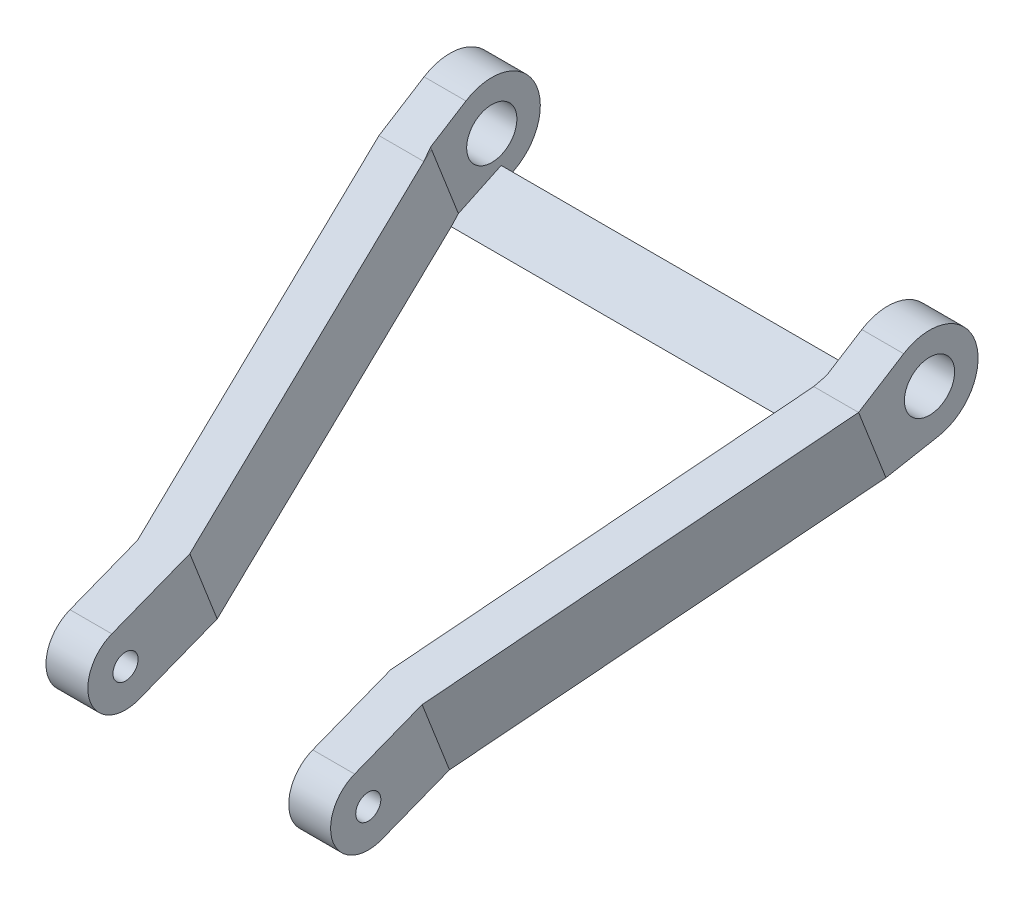
ISO-10303-21;
HEADER;
FILE_DESCRIPTION(('STEP AP214'),'2;1');
FILE_NAME('part.step','',(''),(''),'','','');
FILE_SCHEMA(('AUTOMOTIVE_DESIGN { 1 0 10303 214 1 1 1 1 }'));
ENDSEC;
DATA;
#1=APPLICATION_CONTEXT('core data for automotive mechanical design processes');
#2=APPLICATION_PROTOCOL_DEFINITION('international standard','automotive_design',2000,#1);
#3=PRODUCT_CONTEXT('',#1,'mechanical');
#4=PRODUCT('Part','Part','',(#3));
#5=PRODUCT_RELATED_PRODUCT_CATEGORY('part','',(#4));
#6=PRODUCT_DEFINITION_FORMATION('','',#4);
#7=PRODUCT_DEFINITION_CONTEXT('part definition',#1,'design');
#8=PRODUCT_DEFINITION('design','',#6,#7);
#9=PRODUCT_DEFINITION_SHAPE('','',#8);
#10=(LENGTH_UNIT() NAMED_UNIT(*) SI_UNIT(.MILLI.,.METRE.));
#11=(NAMED_UNIT(*) PLANE_ANGLE_UNIT() SI_UNIT($,.RADIAN.));
#12=(NAMED_UNIT(*) SI_UNIT($,.STERADIAN.) SOLID_ANGLE_UNIT());
#13=UNCERTAINTY_MEASURE_WITH_UNIT(LENGTH_MEASURE(1.E-05),#10,'distance_accuracy_value','');
#14=(GEOMETRIC_REPRESENTATION_CONTEXT(3) GLOBAL_UNCERTAINTY_ASSIGNED_CONTEXT((#13)) GLOBAL_UNIT_ASSIGNED_CONTEXT((#10,
#11,#12)) REPRESENTATION_CONTEXT('',''));
#15=CARTESIAN_POINT('',(0.,0.,0.));
#16=DIRECTION('',(0.,0.,1.));
#17=DIRECTION('',(1.,0.,0.));
#18=AXIS2_PLACEMENT_3D('',#15,#16,#17);
#19=CARTESIAN_POINT('',(34.120658976696,60.3909629733149,82.3929738047805));
#20=DIRECTION('',(1.,0.,0.));
#21=DIRECTION('',(0.,-0.931603821902385,-0.363475334812239));
#22=AXIS2_PLACEMENT_3D('',#19,#20,#21);
#23=PLANE('',#22);
#24=CARTESIAN_POINT('',(34.1206589766954,72.9910744899168,23.4764782511687));
#25=DIRECTION('',(1.,0.,0.));
#26=DIRECTION('',(0.,1.,0.));
#27=AXIS2_PLACEMENT_3D('',#24,#25,#26);
#28=CIRCLE('',#27,3.);
#29=CARTESIAN_POINT('',(34.1206589766954,75.9910744899168,23.4764782511687));
#30=VERTEX_POINT('',#29);
#31=EDGE_CURVE('E285',#30,#30,#28,.T.);
#32=ORIENTED_EDGE('',*,*,#31,.T.);
#33=EDGE_LOOP('',(#32));
#34=FACE_BOUND('',#33,.T.);
#35=CARTESIAN_POINT('',(34.1206589766951,72.9910744899168,23.4764782511687));
#36=DIRECTION('',(1.,0.,0.));
#37=DIRECTION('',(0.,1.,0.));
#38=AXIS2_PLACEMENT_3D('',#35,#36,#37);
#39=CIRCLE('',#38,5.80029163560258);
#40=CARTESIAN_POINT('',(34.1206589766951,67.2873889922915,22.4222701112737));
#41=VERTEX_POINT('',#40);
#42=CARTESIAN_POINT('',(34.120658976695,77.9016243386705,26.5635291482136));
#43=VERTEX_POINT('',#42);
#44=EDGE_CURVE('E481',#41,#43,#39,.T.);
#45=ORIENTED_EDGE('',*,*,#44,.F.);
#46=DIRECTION('',(0.,0.181750885321719,-0.983344606780742));
#47=VECTOR('',#46,1.);
#48=CARTESIAN_POINT('',(34.1206589766951,69.07205107404,12.7665381465735));
#49=LINE('',#48,#47);
#50=CARTESIAN_POINT('',(34.1206589766951,66.1310406703247,28.6785746346503));
#51=VERTEX_POINT('',#50);
#52=EDGE_CURVE('E476',#51,#41,#49,.T.);
#53=ORIENTED_EDGE('',*,*,#52,.F.);
#54=DIRECTION('',(0.,0.931603821902385,0.363475334812239));
#55=VECTOR('',#54,1.);
#56=CARTESIAN_POINT('',(34.120658976696,66.1310406703247,28.6785746346503));
#57=LINE('',#56,#55);
#58=CARTESIAN_POINT('',(34.1206589766951,74.5154750674462,31.9498526479605));
#59=VERTEX_POINT('',#58);
#60=EDGE_CURVE('E249',#51,#59,#57,.T.);
#61=ORIENTED_EDGE('',*,*,#60,.T.);
#62=DIRECTION('',(0.,0.532223393406022,-0.846603956706664));
#63=VECTOR('',#62,1.);
#64=CARTESIAN_POINT('',(34.1206589766951,67.8041341734298,42.6255347507706));
#65=LINE('',#64,#63);
#66=EDGE_CURVE('E483',#59,#43,#65,.T.);
#67=ORIENTED_EDGE('',*,*,#66,.T.);
#68=EDGE_LOOP('',(#45,#53,#61,#67));
#69=FACE_BOUND('',#68,.T.);
#70=ADVANCED_FACE('F106',(#34,#69),#23,.F.);
#71=CARTESIAN_POINT('',(39.1206589766959,78.6371930277265,21.3857019702141));
#72=DIRECTION('',(-1.,0.,0.));
#73=DIRECTION('',(0.,0.931603821902385,0.363475334812239));
#74=AXIS2_PLACEMENT_3D('',#71,#72,#73);
#75=PLANE('',#74);
#76=CARTESIAN_POINT('',(39.1206589766959,72.9910744899168,23.4764782511687));
#77=DIRECTION('',(-1.,0.,0.));
#78=DIRECTION('',(0.,-1.,0.));
#79=AXIS2_PLACEMENT_3D('',#76,#77,#78);
#80=CIRCLE('',#79,3.);
#81=CARTESIAN_POINT('',(39.1206589766959,69.9910744899168,23.4764782511687));
#82=VERTEX_POINT('',#81);
#83=EDGE_CURVE('E281',#82,#82,#80,.T.);
#84=ORIENTED_EDGE('',*,*,#83,.T.);
#85=EDGE_LOOP('',(#84));
#86=FACE_BOUND('',#85,.T.);
#87=DIRECTION('',(0.,0.903908239724991,0.427726424431866));
#88=VECTOR('',#87,1.);
#89=CARTESIAN_POINT('',(39.120658976696,66.4134009221729,21.0680376832798));
#90=LINE('',#89,#88);
#91=CARTESIAN_POINT('',(39.120658976696,67.5075795570489,21.5857994367601));
#92=VERTEX_POINT('',#91);
#93=CARTESIAN_POINT('',(39.1206589766959,69.1251256413478,22.3512169565754));
#94=VERTEX_POINT('',#93);
#95=EDGE_CURVE('E124',#92,#94,#90,.T.);
#96=ORIENTED_EDGE('',*,*,#95,.F.);
#97=CARTESIAN_POINT('',(39.1206589766959,72.9910744899168,23.4764782511687));
#98=DIRECTION('',(-1.,0.,0.));
#99=DIRECTION('',(0.,-1.,0.));
#100=AXIS2_PLACEMENT_3D('',#97,#98,#99);
#101=CIRCLE('',#100,5.80029163560258);
#102=CARTESIAN_POINT('',(39.1206589766959,77.9016243386705,26.5635291482136));
#103=VERTEX_POINT('',#102);
#104=EDGE_CURVE('E302',#103,#92,#101,.T.);
#105=ORIENTED_EDGE('',*,*,#104,.F.);
#106=DIRECTION('',(0.,-0.532223393406022,0.846603956706664));
#107=VECTOR('',#106,1.);
#108=CARTESIAN_POINT('',(39.1206589766958,80.4430207614376,22.520947980735));
#109=LINE('',#108,#107);
#110=CARTESIAN_POINT('',(39.1206589766959,75.2549732080281,30.7735382289582));
#111=VERTEX_POINT('',#110);
#112=EDGE_CURVE('E295',#103,#111,#109,.T.);
#113=ORIENTED_EDGE('',*,*,#112,.T.);
#114=DIRECTION('',(0.,-0.954738972529964,-0.297444943363354));
#115=VECTOR('',#114,1.);
#116=CARTESIAN_POINT('',(39.1206589766959,77.7791704198332,31.5599413384006));
#117=LINE('',#116,#115);
#118=CARTESIAN_POINT('',(39.1206589766959,74.9149535022433,30.6676065083105));
#119=VERTEX_POINT('',#118);
#120=EDGE_CURVE('E290',#111,#119,#117,.T.);
#121=ORIENTED_EDGE('',*,*,#120,.T.);
#122=DIRECTION('',(0.,-0.931603821902385,-0.363475334812239));
#123=VECTOR('',#122,1.);
#124=CARTESIAN_POINT('',(39.1206589766959,75.0024396796041,30.701740189238));
#125=LINE('',#124,#123);
#126=CARTESIAN_POINT('',(39.120658976696,66.7054914598434,27.4645958568553));
#127=VERTEX_POINT('',#126);
#128=EDGE_CURVE('E410',#119,#127,#125,.T.);
#129=ORIENTED_EDGE('',*,*,#128,.T.);
#130=DIRECTION('',(0.,-0.427726424431866,0.903908239724991));
#131=VECTOR('',#130,1.);
#132=CARTESIAN_POINT('',(39.1206589766959,71.2386500187441,17.8847356019905));
#133=LINE('',#132,#131);
#134=EDGE_CURVE('E278',#94,#127,#133,.T.);
#135=ORIENTED_EDGE('',*,*,#134,.F.);
#136=EDGE_LOOP('',(#96,#105,#113,#121,#129,#135));
#137=FACE_BOUND('',#136,.T.);
#138=ADVANCED_FACE('F300',(#86,#137),#75,.F.);
#139=CARTESIAN_POINT('',(91.4143730359225,66.986493519189,26.8707581552003));
#140=DIRECTION('',(-1.,0.,0.));
#141=DIRECTION('',(0.,-0.427726424431866,0.903908239724991));
#142=AXIS2_PLACEMENT_3D('',#139,#140,#141);
#143=PLANE('',#142);
#144=CARTESIAN_POINT('',(91.4143730359225,72.9910744899173,23.4764782511686));
#145=DIRECTION('',(-1.,0.,0.));
#146=DIRECTION('',(0.,-1.,0.));
#147=AXIS2_PLACEMENT_3D('',#144,#145,#146);
#148=CIRCLE('',#147,3.);
#149=CARTESIAN_POINT('',(91.4143730359225,69.9910744899173,23.4764782511686));
#150=VERTEX_POINT('',#149);
#151=EDGE_CURVE('E326',#150,#150,#148,.T.);
#152=ORIENTED_EDGE('',*,*,#151,.T.);
#153=EDGE_LOOP('',(#152));
#154=FACE_BOUND('',#153,.T.);
#155=DIRECTION('',(0.,-0.181750885321719,0.983344606780742));
#156=VECTOR('',#155,1.);
#157=CARTESIAN_POINT('',(91.4143730359225,66.4823989187325,26.7775867081948));
#158=LINE('',#157,#156);
#159=CARTESIAN_POINT('',(91.4143730359225,67.2873889922921,22.4222701112737));
#160=VERTEX_POINT('',#159);
#161=CARTESIAN_POINT('',(91.4143696906281,66.1310406703253,28.6785746346503));
#162=VERTEX_POINT('',#161);
#163=EDGE_CURVE('E464',#160,#162,#158,.T.);
#164=ORIENTED_EDGE('',*,*,#163,.F.);
#165=CARTESIAN_POINT('',(91.4143730359225,72.9910744899173,23.4764782511686));
#166=DIRECTION('',(1.,0.,0.));
#167=DIRECTION('',(0.,1.,0.));
#168=AXIS2_PLACEMENT_3D('',#165,#166,#167);
#169=CIRCLE('',#168,5.80029163560258);
#170=CARTESIAN_POINT('',(91.4143730359224,77.901624338671,26.5635291482136));
#171=VERTEX_POINT('',#170);
#172=EDGE_CURVE('E110',#160,#171,#169,.T.);
#173=ORIENTED_EDGE('',*,*,#172,.T.);
#174=DIRECTION('',(0.,-0.532223393406022,0.846603956706664));
#175=VECTOR('',#174,1.);
#176=CARTESIAN_POINT('',(91.4143730359225,74.6713533923311,31.7018981081058));
#177=LINE('',#176,#175);
#178=CARTESIAN_POINT('',(91.4143730359225,74.5154750674468,31.9498526479604));
#179=VERTEX_POINT('',#178);
#180=EDGE_CURVE('E138',#171,#179,#177,.T.);
#181=ORIENTED_EDGE('',*,*,#180,.T.);
#182=DIRECTION('',(0.,-0.931603821902385,-0.363475334812239));
#183=VECTOR('',#182,1.);
#184=CARTESIAN_POINT('',(91.4143730359225,74.5154750674468,31.9498526479604));
#185=LINE('',#184,#183);
#186=EDGE_CURVE('E346',#179,#162,#185,.T.);
#187=ORIENTED_EDGE('',*,*,#186,.T.);
#188=EDGE_LOOP('',(#164,#173,#181,#187));
#189=FACE_BOUND('',#188,.T.);
#190=ADVANCED_FACE('F461',(#154,#189),#143,.F.);
#191=CARTESIAN_POINT('',(86.4143730359225,70.2527586306055,18.114423956904));
#192=DIRECTION('',(1.,0.,0.));
#193=DIRECTION('',(0.,-0.931603821902385,-0.363475334812239));
#194=AXIS2_PLACEMENT_3D('',#191,#192,#193);
#195=PLANE('',#194);
#196=CARTESIAN_POINT('',(86.4143730359225,72.9910744899173,23.4764782511686));
#197=DIRECTION('',(1.,0.,0.));
#198=DIRECTION('',(0.,1.,0.));
#199=AXIS2_PLACEMENT_3D('',#196,#197,#198);
#200=CIRCLE('',#199,3.);
#201=CARTESIAN_POINT('',(86.4143730359225,75.9910744899173,23.4764782511686));
#202=VERTEX_POINT('',#201);
#203=EDGE_CURVE('E325',#202,#202,#200,.T.);
#204=ORIENTED_EDGE('',*,*,#203,.T.);
#205=EDGE_LOOP('',(#204));
#206=FACE_BOUND('',#205,.T.);
#207=CARTESIAN_POINT('',(86.4143730359225,72.9910744899173,23.4764782511686));
#208=DIRECTION('',(1.,0.,0.));
#209=DIRECTION('',(0.,1.,0.));
#210=AXIS2_PLACEMENT_3D('',#207,#208,#209);
#211=CIRCLE('',#210,5.80029163560258);
#212=CARTESIAN_POINT('',(86.4143730359225,67.5075795570494,21.58579943676));
#213=VERTEX_POINT('',#212);
#214=CARTESIAN_POINT('',(86.4143730359224,77.901624338671,26.5635291482136));
#215=VERTEX_POINT('',#214);
#216=EDGE_CURVE('E150',#213,#215,#211,.T.);
#217=ORIENTED_EDGE('',*,*,#216,.F.);
#218=DIRECTION('',(0.,-0.903908239724991,-0.427726424431866));
#219=VECTOR('',#218,1.);
#220=CARTESIAN_POINT('',(86.4143730359225,69.1251256413483,22.3512169565754));
#221=LINE('',#220,#219);
#222=CARTESIAN_POINT('',(86.4143730359225,69.1251256413483,22.3512169565754));
#223=VERTEX_POINT('',#222);
#224=EDGE_CURVE('E321',#223,#213,#221,.T.);
#225=ORIENTED_EDGE('',*,*,#224,.F.);
#226=DIRECTION('',(0.,-0.427726424431866,0.903908239724991));
#227=VECTOR('',#226,1.);
#228=CARTESIAN_POINT('',(86.4143730359225,70.9694779324924,18.4535731878156));
#229=LINE('',#228,#227);
#230=CARTESIAN_POINT('',(86.4143730359226,66.7054914598439,27.4645958568553));
#231=VERTEX_POINT('',#230);
#232=EDGE_CURVE('E384',#223,#231,#229,.T.);
#233=ORIENTED_EDGE('',*,*,#232,.T.);
#234=DIRECTION('',(0.,0.931603821902385,0.363475334812239));
#235=VECTOR('',#234,1.);
#236=CARTESIAN_POINT('',(86.4143730359226,66.6180052824831,27.4304621759278));
#237=LINE('',#236,#235);
#238=CARTESIAN_POINT('',(86.4143730359225,74.9149535022438,30.6676065083105));
#239=VERTEX_POINT('',#238);
#240=EDGE_CURVE('E343',#231,#239,#237,.T.);
#241=ORIENTED_EDGE('',*,*,#240,.T.);
#242=DIRECTION('',(0.,-0.954738972529964,-0.297444943363354));
#243=VECTOR('',#242,1.);
#244=CARTESIAN_POINT('',(86.4143730359224,77.7791704198337,31.5599413384006));
#245=LINE('',#244,#243);
#246=CARTESIAN_POINT('',(86.4143730359225,75.2549732080285,30.7735382289582));
#247=VERTEX_POINT('',#246);
#248=EDGE_CURVE('E319',#247,#239,#245,.T.);
#249=ORIENTED_EDGE('',*,*,#248,.F.);
#250=DIRECTION('',(0.,0.532223393406022,-0.846603956706664));
#251=VECTOR('',#250,1.);
#252=CARTESIAN_POINT('',(86.4143730359224,79.5420116798602,23.9541767018756));
#253=LINE('',#252,#251);
#254=EDGE_CURVE('E307',#247,#215,#253,.T.);
#255=ORIENTED_EDGE('',*,*,#254,.T.);
#256=EDGE_LOOP('',(#217,#225,#233,#241,#249,#255));
#257=FACE_BOUND('',#256,.T.);
#258=ADVANCED_FACE('F442',(#206,#257),#195,.F.);
#259=CARTESIAN_POINT('',(86.4143730359225,69.1251256413483,22.3512169565754));
#260=DIRECTION('',(0.,-0.427726424431866,0.903908239724991));
#261=DIRECTION('',(1.,0.,0.));
#262=AXIS2_PLACEMENT_3D('',#259,#260,#261);
#263=PLANE('',#262);
#264=DIRECTION('',(1.,0.,0.));
#265=VECTOR('',#264,1.);
#266=CARTESIAN_POINT('',(34.1206589766951,67.5075795570489,21.5857994367601));
#267=LINE('',#266,#265);
#268=EDGE_CURVE('E12',#92,#213,#267,.T.);
#269=ORIENTED_EDGE('',*,*,#268,.F.);
#270=ORIENTED_EDGE('',*,*,#95,.T.);
#271=DIRECTION('',(-1.,0.,0.));
#272=VECTOR('',#271,1.);
#273=CARTESIAN_POINT('',(86.4143730359225,69.1251256413483,22.3512169565754));
#274=LINE('',#273,#272);
#275=EDGE_CURVE('E392',#223,#94,#274,.T.);
#276=ORIENTED_EDGE('',*,*,#275,.F.);
#277=ORIENTED_EDGE('',*,*,#224,.T.);
#278=EDGE_LOOP('',(#269,#270,#276,#277));
#279=FACE_BOUND('',#278,.T.);
#280=ADVANCED_FACE('F441',(#279),#263,.F.);
#281=CARTESIAN_POINT('',(45.7675160063095,47.1841923442209,77.2402090099819));
#282=DIRECTION('',(0.,-0.931603821902385,-0.363475334812239));
#283=DIRECTION('',(0.,-0.363475334812239,0.931603821902385));
#284=AXIS2_PLACEMENT_3D('',#281,#282,#283);
#285=PLANE('',#284);
#286=DIRECTION('',(0.258819045102521,-0.351090213114205,0.899860191445116));
#287=VECTOR('',#286,1.);
#288=CARTESIAN_POINT('',(34.120658976696,66.1310406703247,28.6785746346503));
#289=LINE('',#288,#287);
#290=CARTESIAN_POINT('',(45.7675160063094,50.3319810801855,69.1722832496805));
#291=VERTEX_POINT('',#290);
#292=EDGE_CURVE('E416',#51,#291,#289,.T.);
#293=ORIENTED_EDGE('',*,*,#292,.F.);
#294=DIRECTION('',(-1.,0.,0.));
#295=VECTOR('',#294,1.);
#296=CARTESIAN_POINT('',(50.7675160063093,66.1310406703249,28.6785746346503));
#297=LINE('',#296,#295);
#298=CARTESIAN_POINT('',(39.4796428253184,66.1310406703248,28.6785746346503));
#299=VERTEX_POINT('',#298);
#300=EDGE_CURVE('E402',#299,#51,#297,.T.);
#301=ORIENTED_EDGE('',*,*,#300,.F.);
#302=DIRECTION('',(0.258819045102521,-0.351090213114205,0.899860191445116));
#303=VECTOR('',#302,1.);
#304=CARTESIAN_POINT('',(39.120658976696,66.6180052824826,27.4304621759278));
#305=LINE('',#304,#303);
#306=CARTESIAN_POINT('',(50.7675160063094,50.8189456923434,67.924170790958));
#307=VERTEX_POINT('',#306);
#308=EDGE_CURVE('E419',#299,#307,#305,.T.);
#309=ORIENTED_EDGE('',*,*,#308,.T.);
#310=DIRECTION('',(0.,0.363475334812239,-0.931603821902385));
#311=VECTOR('',#310,1.);
#312=CARTESIAN_POINT('',(50.7675160063095,47.184192344221,77.2402090099819));
#313=LINE('',#312,#311);
#314=CARTESIAN_POINT('',(50.7675160063095,47.184192344221,77.2402090099819));
#315=VERTEX_POINT('',#314);
#316=EDGE_CURVE('E266',#315,#307,#313,.T.);
#317=ORIENTED_EDGE('',*,*,#316,.F.);
#318=DIRECTION('',(1.,0.,0.));
#319=VECTOR('',#318,1.);
#320=CARTESIAN_POINT('',(45.7675160063095,47.1841923442209,77.2402090099819));
#321=LINE('',#320,#319);
#322=CARTESIAN_POINT('',(45.7675160063095,47.1841923442209,77.2402090099819));
#323=VERTEX_POINT('',#322);
#324=EDGE_CURVE('E275',#323,#315,#321,.T.);
#325=ORIENTED_EDGE('',*,*,#324,.F.);
#326=DIRECTION('',(0.,0.363475334812239,-0.931603821902385));
#327=VECTOR('',#326,1.);
#328=CARTESIAN_POINT('',(45.7675160063095,47.1841923442209,77.2402090099819));
#329=LINE('',#328,#327);
#330=EDGE_CURVE('E267',#323,#291,#329,.T.);
#331=ORIENTED_EDGE('',*,*,#330,.T.);
#332=EDGE_LOOP('',(#293,#301,#309,#317,#325,#331));
#333=FACE_BOUND('',#332,.T.);
#334=ADVANCED_FACE('F108',(#333),#285,.T.);
#335=CARTESIAN_POINT('',(39.1206589766959,75.0024396796041,30.701740189238));
#336=DIRECTION('',(-0.965925826289068,-0.094074339074431,0.241116811598632));
#337=DIRECTION('',(0.258819045102522,-0.351090213114206,0.899860191445116));
#338=AXIS2_PLACEMENT_3D('',#335,#336,#337);
#339=PLANE('',#338);
#340=DIRECTION('',(0.258227844034216,-0.413219673950163,0.873251327869567));
#341=VECTOR('',#340,1.);
#342=CARTESIAN_POINT('',(38.9653035147326,66.9540933624731,26.9392289509019));
#343=LINE('',#342,#341);
#344=EDGE_CURVE('E407',#127,#299,#343,.T.);
#345=ORIENTED_EDGE('',*,*,#344,.F.);
#346=ORIENTED_EDGE('',*,*,#128,.F.);
#347=DIRECTION('',(0.258227844034215,-0.287356813827871,0.922358087790277));
#348=VECTOR('',#347,1.);
#349=CARTESIAN_POINT('',(39.1222971037686,74.9131305889242,30.6734576966669));
#350=LINE('',#349,#348);
#351=CARTESIAN_POINT('',(39.4796428253183,74.5154750674462,31.9498526479604));
#352=VERTEX_POINT('',#351);
#353=EDGE_CURVE('E245',#119,#352,#350,.T.);
#354=ORIENTED_EDGE('',*,*,#353,.T.);
#355=DIRECTION('',(0.258819045102521,-0.351090213114205,0.899860191445116));
#356=VECTOR('',#355,1.);
#357=CARTESIAN_POINT('',(39.1206589766959,75.0024396796041,30.701740189238));
#358=LINE('',#357,#356);
#359=CARTESIAN_POINT('',(50.7675160063094,59.2033800894648,71.1954488042682));
#360=VERTEX_POINT('',#359);
#361=EDGE_CURVE('E237',#352,#360,#358,.T.);
#362=ORIENTED_EDGE('',*,*,#361,.T.);
#363=DIRECTION('',(0.,-0.931603821902385,-0.363475334812239));
#364=VECTOR('',#363,1.);
#365=CARTESIAN_POINT('',(50.7675160063094,55.0111628909041,69.5598097976131));
#366=LINE('',#365,#364);
#367=EDGE_CURVE('E242',#360,#307,#366,.T.);
#368=ORIENTED_EDGE('',*,*,#367,.T.);
#369=ORIENTED_EDGE('',*,*,#308,.F.);
#370=EDGE_LOOP('',(#345,#346,#354,#362,#368,#369));
#371=FACE_BOUND('',#370,.T.);
#372=ADVANCED_FACE('F239',(#371),#339,.F.);
#373=CARTESIAN_POINT('',(45.7675160063094,51.3764095427817,78.875848016637));
#374=DIRECTION('',(1.,0.,0.));
#375=DIRECTION('',(0.,-0.931603821902385,-0.363475334812239));
#376=AXIS2_PLACEMENT_3D('',#373,#374,#375);
#377=CYLINDRICAL_SURFACE('',#376,4.5);
#378=CARTESIAN_POINT('',(50.7675160063094,51.3764095427817,78.875848016637));
#379=DIRECTION('',(-1.,0.,0.));
#380=DIRECTION('',(0.,0.931603821902385,0.363475334812239));
#381=AXIS2_PLACEMENT_3D('',#378,#379,#380);
#382=CIRCLE('',#381,4.5);
#383=CARTESIAN_POINT('',(50.7675160063094,55.5686267413424,80.511487023292));
#384=VERTEX_POINT('',#383);
#385=EDGE_CURVE('E260',#315,#384,#382,.T.);
#386=ORIENTED_EDGE('',*,*,#385,.T.);
#387=DIRECTION('',(1.,0.,0.));
#388=VECTOR('',#387,1.);
#389=CARTESIAN_POINT('',(45.7675160063094,55.5686267413424,80.511487023292));
#390=LINE('',#389,#388);
#391=CARTESIAN_POINT('',(45.7675160063094,55.5686267413424,80.511487023292));
#392=VERTEX_POINT('',#391);
#393=EDGE_CURVE('E257',#392,#384,#390,.T.);
#394=ORIENTED_EDGE('',*,*,#393,.F.);
#395=CARTESIAN_POINT('',(45.7675160063094,51.3764095427817,78.875848016637));
#396=DIRECTION('',(-1.,0.,0.));
#397=DIRECTION('',(0.,0.931603821902385,0.363475334812239));
#398=AXIS2_PLACEMENT_3D('',#395,#396,#397);
#399=CIRCLE('',#398,4.5);
#400=EDGE_CURVE('E270',#323,#392,#399,.T.);
#401=ORIENTED_EDGE('',*,*,#400,.F.);
#402=ORIENTED_EDGE('',*,*,#324,.T.);
#403=EDGE_LOOP('',(#386,#394,#401,#402));
#404=FACE_BOUND('',#403,.T.);
#405=ADVANCED_FACE('F426',(#404),#377,.T.);
#406=CARTESIAN_POINT('',(45.7675160063094,55.5686267413424,80.511487023292));
#407=DIRECTION('',(0.,-0.931603821902385,-0.363475334812239));
#408=DIRECTION('',(0.,-0.363475334812239,0.931603821902385));
#409=AXIS2_PLACEMENT_3D('',#406,#407,#408);
#410=PLANE('',#409);
#411=ORIENTED_EDGE('',*,*,#361,.F.);
#412=DIRECTION('',(-1.,0.,0.));
#413=VECTOR('',#412,1.);
#414=CARTESIAN_POINT('',(50.7675160063092,74.5154750674463,31.9498526479604));
#415=LINE('',#414,#413);
#416=EDGE_CURVE('E297',#352,#59,#415,.T.);
#417=ORIENTED_EDGE('',*,*,#416,.T.);
#418=DIRECTION('',(0.258819045102521,-0.351090213114205,0.899860191445116));
#419=VECTOR('',#418,1.);
#420=CARTESIAN_POINT('',(34.1206589766959,74.5154750674462,31.9498526479604));
#421=LINE('',#420,#419);
#422=CARTESIAN_POINT('',(45.7675160063094,58.7164154773069,72.4435612629906));
#423=VERTEX_POINT('',#422);
#424=EDGE_CURVE('E248',#59,#423,#421,.T.);
#425=ORIENTED_EDGE('',*,*,#424,.T.);
#426=DIRECTION('',(0.,0.363475334812239,-0.931603821902385));
#427=VECTOR('',#426,1.);
#428=CARTESIAN_POINT('',(45.7675160063094,55.5686267413424,80.511487023292));
#429=LINE('',#428,#427);
#430=EDGE_CURVE('E276',#392,#423,#429,.T.);
#431=ORIENTED_EDGE('',*,*,#430,.F.);
#432=ORIENTED_EDGE('',*,*,#393,.T.);
#433=DIRECTION('',(0.,0.363475334812239,-0.931603821902385));
#434=VECTOR('',#433,1.);
#435=CARTESIAN_POINT('',(50.7675160063094,55.5686267413424,80.511487023292));
#436=LINE('',#435,#434);
#437=EDGE_CURVE('E253',#384,#360,#436,.T.);
#438=ORIENTED_EDGE('',*,*,#437,.T.);
#439=EDGE_LOOP('',(#411,#417,#425,#431,#432,#438));
#440=FACE_BOUND('',#439,.T.);
#441=ADVANCED_FACE('F254',(#440),#410,.F.);
#442=CARTESIAN_POINT('',(45.7675160063094,51.3764095427817,78.875848016637));
#443=DIRECTION('',(-1.,0.,0.));
#444=DIRECTION('',(0.,0.931603821902385,0.363475334812239));
#445=AXIS2_PLACEMENT_3D('',#442,#443,#444);
#446=PLANE('',#445);
#447=DIRECTION('',(0.,-0.931603821902385,-0.363475334812239));
#448=VECTOR('',#447,1.);
#449=CARTESIAN_POINT('',(45.7675160063094,58.7164154773069,72.4435612629906));
#450=LINE('',#449,#448);
#451=EDGE_CURVE('E421',#423,#291,#450,.T.);
#452=ORIENTED_EDGE('',*,*,#451,.T.);
#453=ORIENTED_EDGE('',*,*,#330,.F.);
#454=ORIENTED_EDGE('',*,*,#400,.T.);
#455=ORIENTED_EDGE('',*,*,#430,.T.);
#456=EDGE_LOOP('',(#452,#453,#454,#455));
#457=FACE_BOUND('',#456,.T.);
#458=CARTESIAN_POINT('',(45.7675160063094,51.3764095427817,78.875848016637));
#459=DIRECTION('',(-1.,0.,0.));
#460=DIRECTION('',(0.,-1.,0.));
#461=AXIS2_PLACEMENT_3D('',#458,#459,#460);
#462=CIRCLE('',#461,1.5);
#463=CARTESIAN_POINT('',(45.7675160063095,49.8764095427817,78.875848016637));
#464=VERTEX_POINT('',#463);
#465=EDGE_CURVE('E284',#464,#464,#462,.T.);
#466=ORIENTED_EDGE('',*,*,#465,.F.);
#467=EDGE_LOOP('',(#466));
#468=FACE_BOUND('',#467,.T.);
#469=ADVANCED_FACE('F494',(#457,#468),#446,.T.);
#470=CARTESIAN_POINT('',(50.7675160063094,51.3764095427817,78.875848016637));
#471=DIRECTION('',(-1.,0.,0.));
#472=DIRECTION('',(0.,0.931603821902385,0.363475334812239));
#473=AXIS2_PLACEMENT_3D('',#470,#471,#472);
#474=PLANE('',#473);
#475=ORIENTED_EDGE('',*,*,#316,.T.);
#476=ORIENTED_EDGE('',*,*,#367,.F.);
#477=ORIENTED_EDGE('',*,*,#437,.F.);
#478=ORIENTED_EDGE('',*,*,#385,.F.);
#479=EDGE_LOOP('',(#475,#476,#477,#478));
#480=FACE_BOUND('',#479,.T.);
#481=CARTESIAN_POINT('',(50.7675160063094,51.3764095427817,78.875848016637));
#482=DIRECTION('',(-1.,0.,0.));
#483=DIRECTION('',(0.,-1.,0.));
#484=AXIS2_PLACEMENT_3D('',#481,#482,#483);
#485=CIRCLE('',#484,1.5);
#486=CARTESIAN_POINT('',(50.7675160063094,49.8764095427817,78.875848016637));
#487=VERTEX_POINT('',#486);
#488=EDGE_CURVE('E397',#487,#487,#485,.F.);
#489=ORIENTED_EDGE('',*,*,#488,.F.);
#490=EDGE_LOOP('',(#489));
#491=FACE_BOUND('',#490,.T.);
#492=ADVANCED_FACE('F263',(#480,#491),#474,.F.);
#493=CARTESIAN_POINT('',(34.120658976696,66.1310406703247,28.6785746346503));
#494=DIRECTION('',(0.965925826289068,0.094074339074431,-0.241116811598632));
#495=DIRECTION('',(-0.258819045102522,0.351090213114206,-0.899860191445116));
#496=AXIS2_PLACEMENT_3D('',#493,#494,#495);
#497=PLANE('',#496);
#498=ORIENTED_EDGE('',*,*,#451,.F.);
#499=ORIENTED_EDGE('',*,*,#424,.F.);
#500=ORIENTED_EDGE('',*,*,#60,.F.);
#501=ORIENTED_EDGE('',*,*,#292,.T.);
#502=EDGE_LOOP('',(#498,#499,#500,#501));
#503=FACE_BOUND('',#502,.T.);
#504=ADVANCED_FACE('F491',(#503),#497,.F.);
#505=CARTESIAN_POINT('',(59.252797380548,51.3764095427818,78.875848016637));
#506=DIRECTION('',(-1.,0.,0.));
#507=DIRECTION('',(0.,-1.,0.));
#508=AXIS2_PLACEMENT_3D('',#505,#506,#507);
#509=CYLINDRICAL_SURFACE('',#508,1.5);
#510=CARTESIAN_POINT('',(50.7675160063094,49.8764095427817,78.875848016637));
#511=CARTESIAN_POINT('',(50.7154326729761,49.8764095427817,78.875848016637));
#512=CARTESIAN_POINT('',(50.6633493396428,49.8764095427817,78.875848016637));
#513=CARTESIAN_POINT('',(50.5591826729761,49.8764095427817,78.875848016637));
#514=CARTESIAN_POINT('',(50.5070993396428,49.8764095427817,78.875848016637));
#515=CARTESIAN_POINT('',(50.4029326729761,49.8764095427817,78.875848016637));
#516=CARTESIAN_POINT('',(50.3508493396428,49.8764095427817,78.875848016637));
#517=CARTESIAN_POINT('',(50.2466826729761,49.8764095427817,78.875848016637));
#518=CARTESIAN_POINT('',(50.1945993396428,49.8764095427817,78.875848016637));
#519=CARTESIAN_POINT('',(50.0904326729761,49.8764095427817,78.875848016637));
#520=CARTESIAN_POINT('',(50.0383493396428,49.8764095427817,78.875848016637));
#521=CARTESIAN_POINT('',(49.9341826729761,49.8764095427817,78.875848016637));
#522=CARTESIAN_POINT('',(49.8820993396428,49.8764095427817,78.875848016637));
#523=CARTESIAN_POINT('',(49.7779326729761,49.8764095427817,78.875848016637));
#524=CARTESIAN_POINT('',(49.7258493396428,49.8764095427817,78.875848016637));
#525=CARTESIAN_POINT('',(49.6216826729761,49.8764095427817,78.875848016637));
#526=CARTESIAN_POINT('',(49.5695993396428,49.8764095427817,78.875848016637));
#527=CARTESIAN_POINT('',(49.4654326729761,49.8764095427817,78.875848016637));
#528=CARTESIAN_POINT('',(49.4133493396428,49.8764095427817,78.875848016637));
#529=CARTESIAN_POINT('',(49.3091826729761,49.8764095427817,78.875848016637));
#530=CARTESIAN_POINT('',(49.2570993396428,49.8764095427817,78.875848016637));
#531=CARTESIAN_POINT('',(49.1529326729761,49.8764095427817,78.875848016637));
#532=CARTESIAN_POINT('',(49.1008493396428,49.8764095427817,78.875848016637));
#533=CARTESIAN_POINT('',(48.9966826729761,49.8764095427817,78.875848016637));
#534=CARTESIAN_POINT('',(48.9445993396428,49.8764095427817,78.875848016637));
#535=CARTESIAN_POINT('',(48.8404326729761,49.8764095427817,78.875848016637));
#536=CARTESIAN_POINT('',(48.7883493396428,49.8764095427817,78.875848016637));
#537=CARTESIAN_POINT('',(48.6841826729761,49.8764095427817,78.875848016637));
#538=CARTESIAN_POINT('',(48.6320993396428,49.8764095427817,78.875848016637));
#539=CARTESIAN_POINT('',(48.5279326729761,49.8764095427817,78.875848016637));
#540=CARTESIAN_POINT('',(48.4758493396428,49.8764095427817,78.875848016637));
#541=CARTESIAN_POINT('',(48.3716826729761,49.8764095427817,78.875848016637));
#542=CARTESIAN_POINT('',(48.3195993396428,49.8764095427817,78.875848016637));
#543=CARTESIAN_POINT('',(48.2154326729761,49.8764095427817,78.875848016637));
#544=CARTESIAN_POINT('',(48.1633493396428,49.8764095427817,78.875848016637));
#545=CARTESIAN_POINT('',(48.0591826729761,49.8764095427817,78.875848016637));
#546=CARTESIAN_POINT('',(48.0070993396428,49.8764095427817,78.875848016637));
#547=CARTESIAN_POINT('',(47.9029326729761,49.8764095427817,78.875848016637));
#548=CARTESIAN_POINT('',(47.8508493396428,49.8764095427817,78.875848016637));
#549=CARTESIAN_POINT('',(47.7466826729761,49.8764095427817,78.875848016637));
#550=CARTESIAN_POINT('',(47.6945993396428,49.8764095427817,78.875848016637));
#551=CARTESIAN_POINT('',(47.5904326729761,49.8764095427817,78.875848016637));
#552=CARTESIAN_POINT('',(47.5383493396428,49.8764095427817,78.875848016637));
#553=CARTESIAN_POINT('',(47.4341826729761,49.8764095427817,78.875848016637));
#554=CARTESIAN_POINT('',(47.3820993396428,49.8764095427817,78.875848016637));
#555=CARTESIAN_POINT('',(47.2779326729761,49.8764095427817,78.875848016637));
#556=CARTESIAN_POINT('',(47.2258493396428,49.8764095427817,78.875848016637));
#557=CARTESIAN_POINT('',(47.1216826729761,49.8764095427817,78.875848016637));
#558=CARTESIAN_POINT('',(47.0695993396428,49.8764095427817,78.875848016637));
#559=CARTESIAN_POINT('',(46.9654326729761,49.8764095427817,78.875848016637));
#560=CARTESIAN_POINT('',(46.9133493396428,49.8764095427817,78.875848016637));
#561=CARTESIAN_POINT('',(46.8091826729761,49.8764095427817,78.875848016637));
#562=CARTESIAN_POINT('',(46.7570993396428,49.8764095427817,78.875848016637));
#563=CARTESIAN_POINT('',(46.6529326729761,49.8764095427817,78.875848016637));
#564=CARTESIAN_POINT('',(46.6008493396428,49.8764095427817,78.875848016637));
#565=CARTESIAN_POINT('',(46.4966826729761,49.8764095427817,78.875848016637));
#566=CARTESIAN_POINT('',(46.4445993396428,49.8764095427817,78.875848016637));
#567=CARTESIAN_POINT('',(46.3404326729761,49.8764095427817,78.875848016637));
#568=CARTESIAN_POINT('',(46.2883493396428,49.8764095427817,78.875848016637));
#569=CARTESIAN_POINT('',(46.1841826729761,49.8764095427817,78.875848016637));
#570=CARTESIAN_POINT('',(46.1320993396428,49.8764095427817,78.875848016637));
#571=CARTESIAN_POINT('',(46.0279326729761,49.8764095427817,78.875848016637));
#572=CARTESIAN_POINT('',(45.9758493396428,49.8764095427817,78.875848016637));
#573=CARTESIAN_POINT('',(45.8716826729761,49.8764095427817,78.875848016637));
#574=CARTESIAN_POINT('',(45.8195993396428,49.8764095427817,78.875848016637));
#575=CARTESIAN_POINT('',(45.7675160063095,49.8764095427817,78.875848016637));
#576=B_SPLINE_CURVE_WITH_KNOTS('',3,(#510,#511,#512,#513,#514,#515,#516,#517,#518,#519,#520,
#521,#522,#523,#524,#525,#526,#527,#528,#529,#530,#531,#532,#533,#534,#535,#536,#537,#538,#539,
#540,#541,#542,#543,#544,#545,#546,#547,#548,#549,#550,#551,#552,#553,#554,#555,#556,#557,#558,
#559,#560,#561,#562,#563,#564,#565,#566,#567,#568,#569,#570,#571,#572,#573,#574,#575),
.UNSPECIFIED.,.F.,.F.,(4,2,2,2,2,2,2,2,2,2,2,2,2,2,2,2,2,2,2,2,2,2,2,2,2,2,2,2,2,2,2,2,4),(0.,
0.156249999999997,0.3125,0.468749999999997,0.624999999999994,0.781249999999997,
0.937499999999994,1.09375,1.24999999999999,1.40625,1.56249999999999,1.71875,1.87499999999999,
2.03124999999999,2.1875,2.34374999999999,2.5,2.65624999999999,2.8125,2.96874999999999,3.125,
3.28124999999999,3.43749999999999,3.59374999999999,3.74999999999999,3.90624999999999,
4.06249999999999,4.21874999999999,4.37499999999999,4.53124999999999,4.68749999999999,
4.84374999999999,4.99999999999999),.UNSPECIFIED.);
#577=EDGE_CURVE('BSEAM546',#487,#464,#576,.T.);
#578=ORIENTED_EDGE('',*,*,#488,.T.);
#579=ORIENTED_EDGE('',*,*,#465,.T.);
#580=ORIENTED_EDGE('',*,*,#577,.T.);
#581=ORIENTED_EDGE('',*,*,#577,.F.);
#582=EDGE_LOOP('',(#578,#580,#579,#581));
#583=FACE_BOUND('',#582,.T.);
#584=ADVANCED_FACE('F546',(#583),#509,.F.);
#585=CARTESIAN_POINT('',(34.1206589766954,72.9910744899168,23.4764782511687));
#586=DIRECTION('',(1.,0.,0.));
#587=DIRECTION('',(0.,1.,0.));
#588=AXIS2_PLACEMENT_3D('',#585,#586,#587);
#589=CYLINDRICAL_SURFACE('',#588,3.);
#590=ORIENTED_EDGE('',*,*,#31,.F.);
#591=EDGE_LOOP('',(#590));
#592=FACE_BOUND('',#591,.T.);
#593=ORIENTED_EDGE('',*,*,#83,.F.);
#594=EDGE_LOOP('',(#593));
#595=FACE_BOUND('',#594,.T.);
#596=ADVANCED_FACE('F585',(#592,#595),#589,.F.);
#597=CARTESIAN_POINT('',(86.4143730359225,66.986493519189,26.8707581552003));
#598=DIRECTION('',(0.,-0.903908239724991,-0.427726424431866));
#599=DIRECTION('',(0.,0.427726424431866,-0.903908239724991));
#600=AXIS2_PLACEMENT_3D('',#597,#598,#599);
#601=PLANE('',#600);
#602=ORIENTED_EDGE('',*,*,#134,.T.);
#603=ORIENTED_EDGE('',*,*,#344,.T.);
#604=DIRECTION('',(-1.,0.,0.));
#605=VECTOR('',#604,1.);
#606=CARTESIAN_POINT('',(91.4143730359226,66.1310406703253,28.6785746346503));
#607=LINE('',#606,#605);
#608=CARTESIAN_POINT('',(86.0553891873001,66.1310406703252,28.6785746346503));
#609=VERTEX_POINT('',#608);
#610=EDGE_CURVE('E386',#609,#299,#607,.T.);
#611=ORIENTED_EDGE('',*,*,#610,.F.);
#612=DIRECTION('',(-0.258227844034207,-0.413219673950168,0.873251327869567));
#613=VECTOR('',#612,1.);
#614=CARTESIAN_POINT('',(86.4127349088499,66.7028701068392,27.4701355253089));
#615=LINE('',#614,#613);
#616=EDGE_CURVE('E337',#231,#609,#615,.T.);
#617=ORIENTED_EDGE('',*,*,#616,.F.);
#618=ORIENTED_EDGE('',*,*,#232,.F.);
#619=ORIENTED_EDGE('',*,*,#275,.T.);
#620=EDGE_LOOP('',(#602,#603,#611,#617,#618,#619));
#621=FACE_BOUND('',#620,.T.);
#622=ADVANCED_FACE('F438',(#621),#601,.F.);
#623=CARTESIAN_POINT('',(79.7675160063094,55.5686267413428,80.5114870232921));
#624=DIRECTION('',(0.,0.931603821902385,0.363475334812239));
#625=DIRECTION('',(0.,-0.363475334812239,0.931603821902385));
#626=AXIS2_PLACEMENT_3D('',#623,#624,#625);
#627=PLANE('',#626);
#628=DIRECTION('',(-0.258819045102514,-0.351090213114211,0.899860191445116));
#629=VECTOR('',#628,1.);
#630=CARTESIAN_POINT('',(91.4143730359225,74.5154750674468,31.9498526479604));
#631=LINE('',#630,#629);
#632=CARTESIAN_POINT('',(79.7675160063094,58.7164154773073,72.4435612629907));
#633=VERTEX_POINT('',#632);
#634=EDGE_CURVE('E354',#179,#633,#631,.T.);
#635=ORIENTED_EDGE('',*,*,#634,.F.);
#636=DIRECTION('',(1.,0.,0.));
#637=VECTOR('',#636,1.);
#638=CARTESIAN_POINT('',(74.7675160063092,74.5154750674466,31.9498526479605));
#639=LINE('',#638,#637);
#640=CARTESIAN_POINT('',(86.0553891873,74.5154750674467,31.9498526479604));
#641=VERTEX_POINT('',#640);
#642=EDGE_CURVE('E333',#641,#179,#639,.T.);
#643=ORIENTED_EDGE('',*,*,#642,.F.);
#644=DIRECTION('',(-0.258819045102514,-0.351090213114211,0.899860191445116));
#645=VECTOR('',#644,1.);
#646=CARTESIAN_POINT('',(86.4143730359225,75.0024396796046,30.701740189238));
#647=LINE('',#646,#645);
#648=CARTESIAN_POINT('',(74.7675160063094,59.2033800894651,71.1954488042682));
#649=VERTEX_POINT('',#648);
#650=EDGE_CURVE('E357',#641,#649,#647,.T.);
#651=ORIENTED_EDGE('',*,*,#650,.T.);
#652=DIRECTION('',(0.,0.363475334812239,-0.931603821902385));
#653=VECTOR('',#652,1.);
#654=CARTESIAN_POINT('',(74.7675160063094,55.5686267413427,80.5114870232921));
#655=LINE('',#654,#653);
#656=CARTESIAN_POINT('',(74.7675160063094,55.5686267413427,80.5114870232921));
#657=VERTEX_POINT('',#656);
#658=EDGE_CURVE('E361',#657,#649,#655,.T.);
#659=ORIENTED_EDGE('',*,*,#658,.F.);
#660=DIRECTION('',(-1.,0.,0.));
#661=VECTOR('',#660,1.);
#662=CARTESIAN_POINT('',(79.7675160063094,55.5686267413428,80.5114870232921));
#663=LINE('',#662,#661);
#664=CARTESIAN_POINT('',(79.7675160063094,55.5686267413428,80.5114870232921));
#665=VERTEX_POINT('',#664);
#666=EDGE_CURVE('E382',#665,#657,#663,.T.);
#667=ORIENTED_EDGE('',*,*,#666,.F.);
#668=DIRECTION('',(0.,0.363475334812239,-0.931603821902385));
#669=VECTOR('',#668,1.);
#670=CARTESIAN_POINT('',(79.7675160063094,55.5686267413428,80.5114870232921));
#671=LINE('',#670,#669);
#672=EDGE_CURVE('E362',#665,#633,#671,.T.);
#673=ORIENTED_EDGE('',*,*,#672,.T.);
#674=EDGE_LOOP('',(#635,#643,#651,#659,#667,#673));
#675=FACE_BOUND('',#674,.T.);
#676=ADVANCED_FACE('F454',(#675),#627,.T.);
#677=CARTESIAN_POINT('',(86.4143730359226,66.6180052824831,27.4304621759278));
#678=DIRECTION('',(0.96592582628907,-0.0940743390744121,0.241116811598631));
#679=DIRECTION('',(-0.258819045102514,-0.351090213114211,0.899860191445116));
#680=AXIS2_PLACEMENT_3D('',#677,#678,#679);
#681=PLANE('',#680);
#682=DIRECTION('',(-0.258227844034208,-0.287356813827876,0.922358087790277));
#683=VECTOR('',#682,1.);
#684=CARTESIAN_POINT('',(86.5697284978858,75.0878335831178,30.1126959123591));
#685=LINE('',#684,#683);
#686=EDGE_CURVE('E340',#239,#641,#685,.T.);
#687=ORIENTED_EDGE('',*,*,#686,.F.);
#688=ORIENTED_EDGE('',*,*,#240,.F.);
#689=ORIENTED_EDGE('',*,*,#616,.T.);
#690=DIRECTION('',(-0.258819045102514,-0.351090213114211,0.899860191445116));
#691=VECTOR('',#690,1.);
#692=CARTESIAN_POINT('',(86.4143730359226,66.6180052824831,27.4304621759278));
#693=LINE('',#692,#691);
#694=CARTESIAN_POINT('',(74.7675160063094,50.8189456923436,67.9241707909581));
#695=VERTEX_POINT('',#694);
#696=EDGE_CURVE('E349',#609,#695,#693,.T.);
#697=ORIENTED_EDGE('',*,*,#696,.T.);
#698=DIRECTION('',(0.,0.931603821902385,0.363475334812239));
#699=VECTOR('',#698,1.);
#700=CARTESIAN_POINT('',(74.7675160063094,55.0111628909044,69.5598097976131));
#701=LINE('',#700,#699);
#702=EDGE_CURVE('E366',#695,#649,#701,.T.);
#703=ORIENTED_EDGE('',*,*,#702,.T.);
#704=ORIENTED_EDGE('',*,*,#650,.F.);
#705=EDGE_LOOP('',(#687,#688,#689,#697,#703,#704));
#706=FACE_BOUND('',#705,.T.);
#707=ADVANCED_FACE('F447',(#706),#681,.F.);
#708=CARTESIAN_POINT('',(79.7675160063094,51.376409542782,78.875848016637));
#709=DIRECTION('',(-1.,0.,0.));
#710=DIRECTION('',(0.,0.931603821902385,0.363475334812239));
#711=AXIS2_PLACEMENT_3D('',#708,#709,#710);
#712=CYLINDRICAL_SURFACE('',#711,4.5);
#713=CARTESIAN_POINT('',(74.7675160063094,51.376409542782,78.875848016637));
#714=DIRECTION('',(1.,0.,0.));
#715=DIRECTION('',(0.,-0.931603821902385,-0.363475334812239));
#716=AXIS2_PLACEMENT_3D('',#713,#714,#715);
#717=CIRCLE('',#716,4.5);
#718=CARTESIAN_POINT('',(74.7675160063095,47.1841923442212,77.2402090099819));
#719=VERTEX_POINT('',#718);
#720=EDGE_CURVE('E373',#657,#719,#717,.T.);
#721=ORIENTED_EDGE('',*,*,#720,.T.);
#722=DIRECTION('',(-1.,0.,0.));
#723=VECTOR('',#722,1.);
#724=CARTESIAN_POINT('',(79.7675160063095,47.1841923442213,77.2402090099819));
#725=LINE('',#724,#723);
#726=CARTESIAN_POINT('',(79.7675160063095,47.1841923442213,77.2402090099819));
#727=VERTEX_POINT('',#726);
#728=EDGE_CURVE('E370',#727,#719,#725,.T.);
#729=ORIENTED_EDGE('',*,*,#728,.F.);
#730=CARTESIAN_POINT('',(79.7675160063094,51.376409542782,78.875848016637));
#731=DIRECTION('',(1.,0.,0.));
#732=DIRECTION('',(0.,-0.931603821902385,-0.363475334812239));
#733=AXIS2_PLACEMENT_3D('',#730,#731,#732);
#734=CIRCLE('',#733,4.5);
#735=EDGE_CURVE('E365',#665,#727,#734,.T.);
#736=ORIENTED_EDGE('',*,*,#735,.F.);
#737=ORIENTED_EDGE('',*,*,#666,.T.);
#738=EDGE_LOOP('',(#721,#729,#736,#737));
#739=FACE_BOUND('',#738,.T.);
#740=ADVANCED_FACE('F513',(#739),#712,.T.);
#741=CARTESIAN_POINT('',(79.7675160063095,47.1841923442213,77.2402090099819));
#742=DIRECTION('',(0.,0.931603821902385,0.363475334812239));
#743=DIRECTION('',(0.,-0.363475334812239,0.931603821902385));
#744=AXIS2_PLACEMENT_3D('',#741,#742,#743);
#745=PLANE('',#744);
#746=ORIENTED_EDGE('',*,*,#696,.F.);
#747=EDGE_CURVE('E389',#162,#609,#607,.T.);
#748=ORIENTED_EDGE('',*,*,#747,.F.);
#749=DIRECTION('',(-0.258819045102514,-0.351090213114211,0.899860191445116));
#750=VECTOR('',#749,1.);
#751=CARTESIAN_POINT('',(91.4143730359226,66.1310406703253,28.6785746346503));
#752=LINE('',#751,#750);
#753=CARTESIAN_POINT('',(79.7675160063094,50.3319810801858,69.1722832496805));
#754=VERTEX_POINT('',#753);
#755=EDGE_CURVE('E351',#162,#754,#752,.T.);
#756=ORIENTED_EDGE('',*,*,#755,.T.);
#757=DIRECTION('',(0.,0.363475334812239,-0.931603821902385));
#758=VECTOR('',#757,1.);
#759=CARTESIAN_POINT('',(79.7675160063095,47.1841923442213,77.2402090099819));
#760=LINE('',#759,#758);
#761=EDGE_CURVE('E368',#727,#754,#760,.T.);
#762=ORIENTED_EDGE('',*,*,#761,.F.);
#763=ORIENTED_EDGE('',*,*,#728,.T.);
#764=DIRECTION('',(0.,0.363475334812239,-0.931603821902385));
#765=VECTOR('',#764,1.);
#766=CARTESIAN_POINT('',(74.7675160063095,47.1841923442212,77.2402090099819));
#767=LINE('',#766,#765);
#768=EDGE_CURVE('E375',#719,#695,#767,.T.);
#769=ORIENTED_EDGE('',*,*,#768,.T.);
#770=EDGE_LOOP('',(#746,#748,#756,#762,#763,#769));
#771=FACE_BOUND('',#770,.T.);
#772=ADVANCED_FACE('F502',(#771),#745,.F.);
#773=CARTESIAN_POINT('',(79.7675160063094,51.376409542782,78.875848016637));
#774=DIRECTION('',(1.,0.,0.));
#775=DIRECTION('',(0.,-0.931603821902385,-0.363475334812239));
#776=AXIS2_PLACEMENT_3D('',#773,#774,#775);
#777=PLANE('',#776);
#778=DIRECTION('',(0.,0.931603821902385,0.363475334812239));
#779=VECTOR('',#778,1.);
#780=CARTESIAN_POINT('',(79.7675160063094,50.3319810801858,69.1722832496805));
#781=LINE('',#780,#779);
#782=EDGE_CURVE('E359',#754,#633,#781,.T.);
#783=ORIENTED_EDGE('',*,*,#782,.T.);
#784=ORIENTED_EDGE('',*,*,#672,.F.);
#785=ORIENTED_EDGE('',*,*,#735,.T.);
#786=ORIENTED_EDGE('',*,*,#761,.T.);
#787=EDGE_LOOP('',(#783,#784,#785,#786));
#788=FACE_BOUND('',#787,.T.);
#789=CARTESIAN_POINT('',(79.7675160063094,51.376409542782,78.875848016637));
#790=DIRECTION('',(1.,0.,0.));
#791=DIRECTION('',(0.,1.,0.));
#792=AXIS2_PLACEMENT_3D('',#789,#790,#791);
#793=CIRCLE('',#792,1.5);
#794=CARTESIAN_POINT('',(79.7675160063094,52.876409542782,78.875848016637));
#795=VERTEX_POINT('',#794);
#796=EDGE_CURVE('E329',#795,#795,#793,.T.);
#797=ORIENTED_EDGE('',*,*,#796,.F.);
#798=EDGE_LOOP('',(#797));
#799=FACE_BOUND('',#798,.T.);
#800=ADVANCED_FACE('F516',(#788,#799),#777,.T.);
#801=CARTESIAN_POINT('',(74.7675160063094,51.376409542782,78.875848016637));
#802=DIRECTION('',(1.,0.,0.));
#803=DIRECTION('',(0.,-0.931603821902385,-0.363475334812239));
#804=AXIS2_PLACEMENT_3D('',#801,#802,#803);
#805=PLANE('',#804);
#806=ORIENTED_EDGE('',*,*,#658,.T.);
#807=ORIENTED_EDGE('',*,*,#702,.F.);
#808=ORIENTED_EDGE('',*,*,#768,.F.);
#809=ORIENTED_EDGE('',*,*,#720,.F.);
#810=EDGE_LOOP('',(#806,#807,#808,#809));
#811=FACE_BOUND('',#810,.T.);
#812=CARTESIAN_POINT('',(74.7675160063094,51.376409542782,78.875848016637));
#813=DIRECTION('',(1.,0.,0.));
#814=DIRECTION('',(0.,1.,0.));
#815=AXIS2_PLACEMENT_3D('',#812,#813,#814);
#816=CIRCLE('',#815,1.5);
#817=CARTESIAN_POINT('',(74.7675160063094,52.876409542782,78.875848016637));
#818=VERTEX_POINT('',#817);
#819=EDGE_CURVE('E330',#818,#818,#816,.F.);
#820=ORIENTED_EDGE('',*,*,#819,.F.);
#821=EDGE_LOOP('',(#820));
#822=FACE_BOUND('',#821,.T.);
#823=ADVANCED_FACE('F506',(#811,#822),#805,.F.);
#824=CARTESIAN_POINT('',(91.4143730359225,74.5154750674468,31.9498526479604));
#825=DIRECTION('',(-0.96592582628907,0.0940743390744121,-0.241116811598631));
#826=DIRECTION('',(0.258819045102514,0.351090213114211,-0.899860191445116));
#827=AXIS2_PLACEMENT_3D('',#824,#825,#826);
#828=PLANE('',#827);
#829=ORIENTED_EDGE('',*,*,#782,.F.);
#830=ORIENTED_EDGE('',*,*,#755,.F.);
#831=ORIENTED_EDGE('',*,*,#186,.F.);
#832=ORIENTED_EDGE('',*,*,#634,.T.);
#833=EDGE_LOOP('',(#829,#830,#831,#832));
#834=FACE_BOUND('',#833,.T.);
#835=ADVANCED_FACE('F520',(#834),#828,.F.);
#836=CARTESIAN_POINT('',(66.2822346320709,51.3764095427819,78.875848016637));
#837=DIRECTION('',(1.,0.,0.));
#838=DIRECTION('',(0.,1.,0.));
#839=AXIS2_PLACEMENT_3D('',#836,#837,#838);
#840=CYLINDRICAL_SURFACE('',#839,1.5);
#841=ORIENTED_EDGE('',*,*,#819,.T.);
#842=EDGE_LOOP('',(#841));
#843=FACE_BOUND('',#842,.T.);
#844=ORIENTED_EDGE('',*,*,#796,.T.);
#845=EDGE_LOOP('',(#844));
#846=FACE_BOUND('',#845,.T.);
#847=ADVANCED_FACE('F522',(#843,#846),#840,.F.);
#848=CARTESIAN_POINT('',(34.1206589766954,72.9910744899168,23.4764782511687));
#849=DIRECTION('',(1.,0.,0.));
#850=DIRECTION('',(0.,1.,0.));
#851=AXIS2_PLACEMENT_3D('',#848,#849,#850);
#852=CYLINDRICAL_SURFACE('',#851,3.);
#853=ORIENTED_EDGE('',*,*,#203,.F.);
#854=EDGE_LOOP('',(#853));
#855=FACE_BOUND('',#854,.T.);
#856=ORIENTED_EDGE('',*,*,#151,.F.);
#857=EDGE_LOOP('',(#856));
#858=FACE_BOUND('',#857,.T.);
#859=ADVANCED_FACE('F528',(#855,#858),#852,.F.);
#860=CARTESIAN_POINT('',(86.4143730359224,77.7791704198337,31.5599413384006));
#861=DIRECTION('',(0.966084044255695,-0.07680856644359,0.246540186491859));
#862=DIRECTION('',(0.247270658986361,0.,-0.96894644909017));
#863=AXIS2_PLACEMENT_3D('',#860,#861,#862);
#864=PLANE('',#863);
#865=ORIENTED_EDGE('',*,*,#686,.T.);
#866=DIRECTION('',(0.250149749407741,0.515302499719373,-0.819688011779));
#867=VECTOR('',#866,1.);
#868=CARTESIAN_POINT('',(86.5785012724417,75.5930734489968,30.2357245865789));
#869=LINE('',#868,#867);
#870=EDGE_CURVE('E303',#641,#247,#869,.T.);
#871=ORIENTED_EDGE('',*,*,#870,.T.);
#872=ORIENTED_EDGE('',*,*,#248,.T.);
#873=EDGE_LOOP('',(#865,#871,#872));
#874=FACE_BOUND('',#873,.T.);
#875=ADVANCED_FACE('F451',(#874),#864,.F.);
#876=CARTESIAN_POINT('',(39.4796428253183,77.3796919850361,32.8421874780505));
#877=DIRECTION('',(-0.966084044255693,-0.0768085664436093,0.24654018649186));
#878=DIRECTION('',(0.247270658986364,0.,0.96894644909017));
#879=AXIS2_PLACEMENT_3D('',#876,#877,#878);
#880=PLANE('',#879);
#881=ORIENTED_EDGE('',*,*,#120,.F.);
#882=DIRECTION('',(0.250149749407753,-0.515302499719368,0.819688011778999));
#883=VECTOR('',#882,1.);
#884=CARTESIAN_POINT('',(39.2934058429248,74.899118796032,31.33959330459));
#885=LINE('',#884,#883);
#886=EDGE_CURVE('E116',#111,#352,#885,.T.);
#887=ORIENTED_EDGE('',*,*,#886,.T.);
#888=ORIENTED_EDGE('',*,*,#353,.F.);
#889=EDGE_LOOP('',(#881,#887,#888));
#890=FACE_BOUND('',#889,.T.);
#891=ADVANCED_FACE('F289',(#890),#880,.F.);
#892=CARTESIAN_POINT('',(34.1206589766951,67.8041341734298,42.6255347507706));
#893=DIRECTION('',(0.,-0.846603956706664,-0.532223393406022));
#894=DIRECTION('',(0.,0.532223393406022,-0.846603956706664));
#895=AXIS2_PLACEMENT_3D('',#892,#893,#894);
#896=PLANE('',#895);
#897=DIRECTION('',(1.,0.,0.));
#898=VECTOR('',#897,1.);
#899=CARTESIAN_POINT('',(34.120658976695,77.9016243386705,26.5635291482136));
#900=LINE('',#899,#898);
#901=EDGE_CURVE('E304',#43,#103,#900,.T.);
#902=ORIENTED_EDGE('',*,*,#901,.F.);
#903=ORIENTED_EDGE('',*,*,#66,.F.);
#904=ORIENTED_EDGE('',*,*,#416,.F.);
#905=ORIENTED_EDGE('',*,*,#886,.F.);
#906=ORIENTED_EDGE('',*,*,#112,.F.);
#907=EDGE_LOOP('',(#902,#903,#904,#905,#906));
#908=FACE_BOUND('',#907,.T.);
#909=ADVANCED_FACE('F294',(#908),#896,.F.);
#910=CARTESIAN_POINT('',(34.1206589766951,72.9910744899168,23.4764782511687));
#911=DIRECTION('',(1.,0.,0.));
#912=DIRECTION('',(0.,1.,0.));
#913=AXIS2_PLACEMENT_3D('',#910,#911,#912);
#914=CYLINDRICAL_SURFACE('',#913,5.80029163560258);
#915=ORIENTED_EDGE('',*,*,#104,.T.);
#916=ORIENTED_EDGE('',*,*,#268,.T.);
#917=ORIENTED_EDGE('',*,*,#216,.T.);
#918=EDGE_CURVE('E309',#215,#171,#900,.T.);
#919=ORIENTED_EDGE('',*,*,#918,.T.);
#920=ORIENTED_EDGE('',*,*,#172,.F.);
#921=DIRECTION('',(1.,0.,0.));
#922=VECTOR('',#921,1.);
#923=CARTESIAN_POINT('',(34.1206589766951,67.2873889922915,22.4222701112737));
#924=LINE('',#923,#922);
#925=EDGE_CURVE('E469',#41,#160,#924,.T.);
#926=ORIENTED_EDGE('',*,*,#925,.F.);
#927=ORIENTED_EDGE('',*,*,#44,.T.);
#928=ORIENTED_EDGE('',*,*,#901,.T.);
#929=EDGE_LOOP('',(#915,#916,#917,#919,#920,#926,#927,#928));
#930=FACE_BOUND('',#929,.T.);
#931=ADVANCED_FACE('F468',(#930),#914,.T.);
#932=ORIENTED_EDGE('',*,*,#918,.F.);
#933=ORIENTED_EDGE('',*,*,#254,.F.);
#934=ORIENTED_EDGE('',*,*,#870,.F.);
#935=ORIENTED_EDGE('',*,*,#642,.T.);
#936=ORIENTED_EDGE('',*,*,#180,.F.);
#937=EDGE_LOOP('',(#932,#933,#934,#935,#936));
#938=FACE_BOUND('',#937,.T.);
#939=ADVANCED_FACE('F457',(#938),#896,.F.);
#940=CARTESIAN_POINT('',(34.1206589766951,69.07205107404,12.7665381465735));
#941=DIRECTION('',(0.,-0.983344606780742,-0.181750885321719));
#942=DIRECTION('',(0.,0.181750885321719,-0.983344606780742));
#943=AXIS2_PLACEMENT_3D('',#940,#941,#942);
#944=PLANE('',#943);
#945=ORIENTED_EDGE('',*,*,#163,.T.);
#946=ORIENTED_EDGE('',*,*,#747,.T.);
#947=ORIENTED_EDGE('',*,*,#610,.T.);
#948=ORIENTED_EDGE('',*,*,#300,.T.);
#949=ORIENTED_EDGE('',*,*,#52,.T.);
#950=ORIENTED_EDGE('',*,*,#925,.T.);
#951=EDGE_LOOP('',(#945,#946,#947,#948,#949,#950));
#952=FACE_BOUND('',#951,.T.);
#953=ADVANCED_FACE('F473',(#952),#944,.T.);
#954=CLOSED_SHELL('',(#70,#138,#190,#258,#280,#334,#372,#405,#441,#469,#492,#504,#584,#596,#622,
#676,#707,#740,#772,#800,#823,#835,#847,#859,#875,#891,#909,#931,#939,#953));
#955=MANIFOLD_SOLID_BREP('B2',#954);
#956=ADVANCED_BREP_SHAPE_REPRESENTATION('',(#18,#955),#14);
#957=SHAPE_DEFINITION_REPRESENTATION(#9,#956);
ENDSEC;
END-ISO-10303-21;
